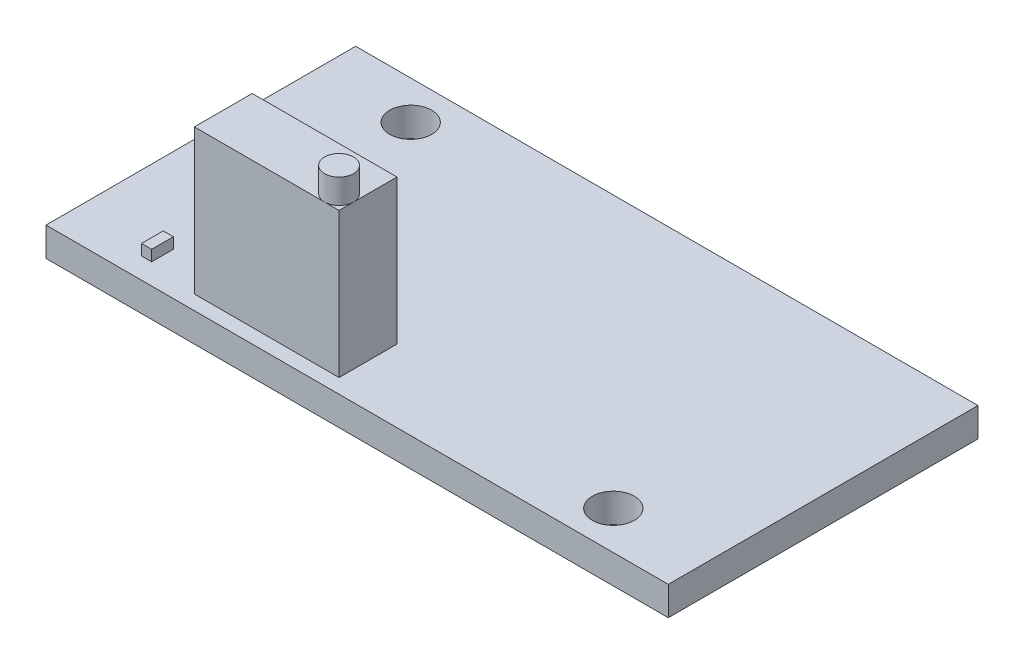
ISO-10303-21;
HEADER;
FILE_DESCRIPTION(('STEP AP214'),'2;1');
FILE_NAME('part.step','',(''),(''),'','','');
FILE_SCHEMA(('AUTOMOTIVE_DESIGN { 1 0 10303 214 1 1 1 1 }'));
ENDSEC;
DATA;
#1=APPLICATION_CONTEXT('core data for automotive mechanical design processes');
#2=APPLICATION_PROTOCOL_DEFINITION('international standard','automotive_design',2000,#1);
#3=PRODUCT_CONTEXT('',#1,'mechanical');
#4=PRODUCT('Part','Part','',(#3));
#5=PRODUCT_RELATED_PRODUCT_CATEGORY('part','',(#4));
#6=PRODUCT_DEFINITION_FORMATION('','',#4);
#7=PRODUCT_DEFINITION_CONTEXT('part definition',#1,'design');
#8=PRODUCT_DEFINITION('design','',#6,#7);
#9=PRODUCT_DEFINITION_SHAPE('','',#8);
#10=(LENGTH_UNIT() NAMED_UNIT(*) SI_UNIT(.MILLI.,.METRE.));
#11=(NAMED_UNIT(*) PLANE_ANGLE_UNIT() SI_UNIT($,.RADIAN.));
#12=(NAMED_UNIT(*) SI_UNIT($,.STERADIAN.) SOLID_ANGLE_UNIT());
#13=UNCERTAINTY_MEASURE_WITH_UNIT(LENGTH_MEASURE(1.E-05),#10,'distance_accuracy_value','');
#14=(GEOMETRIC_REPRESENTATION_CONTEXT(3) GLOBAL_UNCERTAINTY_ASSIGNED_CONTEXT((#13)) GLOBAL_UNIT_ASSIGNED_CONTEXT((#10,
#11,#12)) REPRESENTATION_CONTEXT('',''));
#15=CARTESIAN_POINT('',(0.,0.,0.));
#16=DIRECTION('',(0.,0.,1.));
#17=DIRECTION('',(1.,0.,0.));
#18=AXIS2_PLACEMENT_3D('',#15,#16,#17);
#19=CARTESIAN_POINT('',(0.,2.,0.));
#20=DIRECTION('',(0.,-1.,0.));
#21=DIRECTION('',(0.,0.,-1.));
#22=AXIS2_PLACEMENT_3D('',#19,#20,#21);
#23=PLANE('',#22);
#24=DIRECTION('',(0.,0.,1.));
#25=VECTOR('',#24,1.);
#26=CARTESIAN_POINT('',(-12.25,2.,9.7));
#27=LINE('',#26,#25);
#28=CARTESIAN_POINT('',(-12.25,2.,5.7));
#29=VERTEX_POINT('',#28);
#30=CARTESIAN_POINT('',(-12.25,2.,9.7));
#31=VERTEX_POINT('',#30);
#32=EDGE_CURVE('E160',#29,#31,#27,.T.);
#33=ORIENTED_EDGE('',*,*,#32,.F.);
#34=DIRECTION('',(-1.,0.,0.));
#35=VECTOR('',#34,1.);
#36=CARTESIAN_POINT('',(-2.25,2.,5.7));
#37=LINE('',#36,#35);
#38=CARTESIAN_POINT('',(-2.25,2.,5.7));
#39=VERTEX_POINT('',#38);
#40=EDGE_CURVE('E166',#39,#29,#37,.T.);
#41=ORIENTED_EDGE('',*,*,#40,.F.);
#42=DIRECTION('',(0.,0.,-1.));
#43=VECTOR('',#42,1.);
#44=CARTESIAN_POINT('',(-2.25,2.,9.7));
#45=LINE('',#44,#43);
#46=CARTESIAN_POINT('',(-2.25,2.,9.7));
#47=VERTEX_POINT('',#46);
#48=EDGE_CURVE('E181',#47,#39,#45,.T.);
#49=ORIENTED_EDGE('',*,*,#48,.F.);
#50=DIRECTION('',(1.,0.,0.));
#51=VECTOR('',#50,1.);
#52=CARTESIAN_POINT('',(-2.25,2.,9.7));
#53=LINE('',#52,#51);
#54=EDGE_CURVE('E178',#31,#47,#53,.T.);
#55=ORIENTED_EDGE('',*,*,#54,.F.);
#56=EDGE_LOOP('',(#33,#41,#49,#55));
#57=FACE_BOUND('',#56,.T.);
#58=CARTESIAN_POINT('',(-15.05,2.,-8.05));
#59=DIRECTION('',(0.,1.,0.));
#60=DIRECTION('',(0.,0.,1.));
#61=AXIS2_PLACEMENT_3D('',#58,#59,#60);
#62=CIRCLE('',#61,1.45);
#63=CARTESIAN_POINT('',(-15.05,2.,-6.6));
#64=VERTEX_POINT('',#63);
#65=EDGE_CURVE('E202',#64,#64,#62,.T.);
#66=ORIENTED_EDGE('',*,*,#65,.F.);
#67=EDGE_LOOP('',(#66));
#68=FACE_BOUND('',#67,.T.);
#69=CARTESIAN_POINT('',(15.05,2.,8.05));
#70=DIRECTION('',(0.,1.,0.));
#71=DIRECTION('',(0.,0.,1.));
#72=AXIS2_PLACEMENT_3D('',#69,#70,#71);
#73=CIRCLE('',#72,1.45);
#74=CARTESIAN_POINT('',(15.05,2.,9.5));
#75=VERTEX_POINT('',#74);
#76=EDGE_CURVE('E197',#75,#75,#73,.T.);
#77=ORIENTED_EDGE('',*,*,#76,.F.);
#78=EDGE_LOOP('',(#77));
#79=FACE_BOUND('',#78,.T.);
#80=DIRECTION('',(0.,0.,-1.));
#81=VECTOR('',#80,1.);
#82=CARTESIAN_POINT('',(21.5,2.,10.7));
#83=LINE('',#82,#81);
#84=CARTESIAN_POINT('',(21.5,2.,10.7));
#85=VERTEX_POINT('',#84);
#86=CARTESIAN_POINT('',(21.5,2.,-10.7));
#87=VERTEX_POINT('',#86);
#88=EDGE_CURVE('E210',#85,#87,#83,.T.);
#89=ORIENTED_EDGE('',*,*,#88,.T.);
#90=DIRECTION('',(-1.,0.,0.));
#91=VECTOR('',#90,1.);
#92=CARTESIAN_POINT('',(-21.5,2.,-10.7));
#93=LINE('',#92,#91);
#94=CARTESIAN_POINT('',(-21.5,2.,-10.7));
#95=VERTEX_POINT('',#94);
#96=EDGE_CURVE('E213',#87,#95,#93,.T.);
#97=ORIENTED_EDGE('',*,*,#96,.T.);
#98=DIRECTION('',(0.,0.,1.));
#99=VECTOR('',#98,1.);
#100=CARTESIAN_POINT('',(-21.5,2.,10.7));
#101=LINE('',#100,#99);
#102=CARTESIAN_POINT('',(-21.5,2.,10.7));
#103=VERTEX_POINT('',#102);
#104=EDGE_CURVE('E216',#95,#103,#101,.T.);
#105=ORIENTED_EDGE('',*,*,#104,.T.);
#106=DIRECTION('',(1.,0.,0.));
#107=VECTOR('',#106,1.);
#108=CARTESIAN_POINT('',(-21.5,2.,10.7));
#109=LINE('',#108,#107);
#110=EDGE_CURVE('E218',#103,#85,#109,.T.);
#111=ORIENTED_EDGE('',*,*,#110,.T.);
#112=EDGE_LOOP('',(#89,#97,#105,#111));
#113=FACE_BOUND('',#112,.T.);
#114=DIRECTION('',(0.,0.,1.));
#115=VECTOR('',#114,1.);
#116=CARTESIAN_POINT('',(-16.35,2.,7.75));
#117=LINE('',#116,#115);
#118=CARTESIAN_POINT('',(-16.35,2.,7.75));
#119=VERTEX_POINT('',#118);
#120=CARTESIAN_POINT('',(-16.35,2.,9.25));
#121=VERTEX_POINT('',#120);
#122=EDGE_CURVE('E151',#119,#121,#117,.T.);
#123=ORIENTED_EDGE('',*,*,#122,.F.);
#124=DIRECTION('',(-1.,0.,0.));
#125=VECTOR('',#124,1.);
#126=CARTESIAN_POINT('',(-15.65,2.,7.75));
#127=LINE('',#126,#125);
#128=CARTESIAN_POINT('',(-15.65,2.,7.75));
#129=VERTEX_POINT('',#128);
#130=EDGE_CURVE('E148',#129,#119,#127,.T.);
#131=ORIENTED_EDGE('',*,*,#130,.F.);
#132=DIRECTION('',(0.,0.,-1.));
#133=VECTOR('',#132,1.);
#134=CARTESIAN_POINT('',(-15.65,2.,7.75));
#135=LINE('',#134,#133);
#136=CARTESIAN_POINT('',(-15.65,2.,9.24999999999999));
#137=VERTEX_POINT('',#136);
#138=EDGE_CURVE('E56',#137,#129,#135,.T.);
#139=ORIENTED_EDGE('',*,*,#138,.F.);
#140=DIRECTION('',(1.,0.,0.));
#141=VECTOR('',#140,1.);
#142=CARTESIAN_POINT('',(-15.65,2.,9.24999999999999));
#143=LINE('',#142,#141);
#144=EDGE_CURVE('E51',#121,#137,#143,.T.);
#145=ORIENTED_EDGE('',*,*,#144,.F.);
#146=EDGE_LOOP('',(#123,#131,#139,#145));
#147=FACE_BOUND('',#146,.T.);
#148=ADVANCED_FACE('F34',(#57,#68,#79,#113,#147),#23,.F.);
#149=CARTESIAN_POINT('',(0.,12.,0.));
#150=DIRECTION('',(0.,1.,0.));
#151=DIRECTION('',(0.,0.,1.));
#152=AXIS2_PLACEMENT_3D('',#149,#150,#151);
#153=PLANE('',#152);
#154=CARTESIAN_POINT('',(-3.25,12.,8.7));
#155=DIRECTION('',(0.,1.,0.));
#156=DIRECTION('',(0.,0.,1.));
#157=AXIS2_PLACEMENT_3D('',#154,#155,#156);
#158=CIRCLE('',#157,1.);
#159=CARTESIAN_POINT('',(-3.25,12.,9.7));
#160=VERTEX_POINT('',#159);
#161=CARTESIAN_POINT('',(-2.25,12.,8.7));
#162=VERTEX_POINT('',#161);
#163=EDGE_CURVE('E44',#160,#162,#158,.T.);
#164=ORIENTED_EDGE('',*,*,#163,.F.);
#165=DIRECTION('',(1.,0.,0.));
#166=VECTOR('',#165,1.);
#167=CARTESIAN_POINT('',(-2.25,12.,9.7));
#168=LINE('',#167,#166);
#169=CARTESIAN_POINT('',(-2.25,12.,9.7));
#170=VERTEX_POINT('',#169);
#171=EDGE_CURVE('E165',#160,#170,#168,.T.);
#172=ORIENTED_EDGE('',*,*,#171,.T.);
#173=DIRECTION('',(0.,0.,-1.));
#174=VECTOR('',#173,1.);
#175=CARTESIAN_POINT('',(-2.25,12.,9.7));
#176=LINE('',#175,#174);
#177=EDGE_CURVE('E170',#170,#162,#176,.T.);
#178=ORIENTED_EDGE('',*,*,#177,.T.);
#179=EDGE_LOOP('',(#164,#172,#178));
#180=FACE_BOUND('',#179,.T.);
#181=ADVANCED_FACE('F256',(#180),#153,.T.);
#182=CARTESIAN_POINT('',(21.5,2.,10.7));
#183=DIRECTION('',(-1.,0.,0.));
#184=DIRECTION('',(0.,0.,1.));
#185=AXIS2_PLACEMENT_3D('',#182,#183,#184);
#186=PLANE('',#185);
#187=DIRECTION('',(0.,0.,-1.));
#188=VECTOR('',#187,1.);
#189=CARTESIAN_POINT('',(21.5,0.,10.7));
#190=LINE('',#189,#188);
#191=CARTESIAN_POINT('',(21.5,0.,10.7));
#192=VERTEX_POINT('',#191);
#193=CARTESIAN_POINT('',(21.5,0.,-10.7));
#194=VERTEX_POINT('',#193);
#195=EDGE_CURVE('E201',#192,#194,#190,.T.);
#196=ORIENTED_EDGE('',*,*,#195,.T.);
#197=DIRECTION('',(0.,-1.,0.));
#198=VECTOR('',#197,1.);
#199=CARTESIAN_POINT('',(21.5,2.,-10.7));
#200=LINE('',#199,#198);
#201=EDGE_CURVE('E38',#87,#194,#200,.T.);
#202=ORIENTED_EDGE('',*,*,#201,.F.);
#203=ORIENTED_EDGE('',*,*,#88,.F.);
#204=DIRECTION('',(0.,-1.,0.));
#205=VECTOR('',#204,1.);
#206=CARTESIAN_POINT('',(21.5,2.,10.7));
#207=LINE('',#206,#205);
#208=EDGE_CURVE('E220',#85,#192,#207,.T.);
#209=ORIENTED_EDGE('',*,*,#208,.T.);
#210=EDGE_LOOP('',(#196,#202,#203,#209));
#211=FACE_BOUND('',#210,.T.);
#212=ADVANCED_FACE('F36',(#211),#186,.F.);
#213=CARTESIAN_POINT('',(-21.5,2.,-10.7));
#214=DIRECTION('',(0.,0.,1.));
#215=DIRECTION('',(1.,0.,0.));
#216=AXIS2_PLACEMENT_3D('',#213,#214,#215);
#217=PLANE('',#216);
#218=DIRECTION('',(-1.,0.,0.));
#219=VECTOR('',#218,1.);
#220=CARTESIAN_POINT('',(-21.5,0.,-10.7));
#221=LINE('',#220,#219);
#222=CARTESIAN_POINT('',(-21.5,0.,-10.7));
#223=VERTEX_POINT('',#222);
#224=EDGE_CURVE('E223',#194,#223,#221,.T.);
#225=ORIENTED_EDGE('',*,*,#224,.T.);
#226=DIRECTION('',(0.,-1.,0.));
#227=VECTOR('',#226,1.);
#228=CARTESIAN_POINT('',(-21.5,2.,-10.7));
#229=LINE('',#228,#227);
#230=EDGE_CURVE('E232',#95,#223,#229,.T.);
#231=ORIENTED_EDGE('',*,*,#230,.F.);
#232=ORIENTED_EDGE('',*,*,#96,.F.);
#233=ORIENTED_EDGE('',*,*,#201,.T.);
#234=EDGE_LOOP('',(#225,#231,#232,#233));
#235=FACE_BOUND('',#234,.T.);
#236=ADVANCED_FACE('F241',(#235),#217,.F.);
#237=CARTESIAN_POINT('',(-21.5,2.,10.7));
#238=DIRECTION('',(1.,0.,0.));
#239=DIRECTION('',(0.,0.,-1.));
#240=AXIS2_PLACEMENT_3D('',#237,#238,#239);
#241=PLANE('',#240);
#242=DIRECTION('',(0.,0.,1.));
#243=VECTOR('',#242,1.);
#244=CARTESIAN_POINT('',(-21.5,0.,10.7));
#245=LINE('',#244,#243);
#246=CARTESIAN_POINT('',(-21.5,0.,10.7));
#247=VERTEX_POINT('',#246);
#248=EDGE_CURVE('E225',#223,#247,#245,.T.);
#249=ORIENTED_EDGE('',*,*,#248,.T.);
#250=DIRECTION('',(0.,-1.,0.));
#251=VECTOR('',#250,1.);
#252=CARTESIAN_POINT('',(-21.5,2.,10.7));
#253=LINE('',#252,#251);
#254=EDGE_CURVE('E230',#103,#247,#253,.T.);
#255=ORIENTED_EDGE('',*,*,#254,.F.);
#256=ORIENTED_EDGE('',*,*,#104,.F.);
#257=ORIENTED_EDGE('',*,*,#230,.T.);
#258=EDGE_LOOP('',(#249,#255,#256,#257));
#259=FACE_BOUND('',#258,.T.);
#260=ADVANCED_FACE('F250',(#259),#241,.F.);
#261=CARTESIAN_POINT('',(-21.5,2.,10.7));
#262=DIRECTION('',(0.,0.,-1.));
#263=DIRECTION('',(-1.,0.,0.));
#264=AXIS2_PLACEMENT_3D('',#261,#262,#263);
#265=PLANE('',#264);
#266=DIRECTION('',(1.,0.,0.));
#267=VECTOR('',#266,1.);
#268=CARTESIAN_POINT('',(-21.5,0.,10.7));
#269=LINE('',#268,#267);
#270=EDGE_CURVE('E214',#247,#192,#269,.T.);
#271=ORIENTED_EDGE('',*,*,#270,.T.);
#272=ORIENTED_EDGE('',*,*,#208,.F.);
#273=ORIENTED_EDGE('',*,*,#110,.F.);
#274=ORIENTED_EDGE('',*,*,#254,.T.);
#275=EDGE_LOOP('',(#271,#272,#273,#274));
#276=FACE_BOUND('',#275,.T.);
#277=ADVANCED_FACE('F253',(#276),#265,.F.);
#278=CARTESIAN_POINT('',(0.,0.,0.));
#279=DIRECTION('',(0.,-1.,0.));
#280=DIRECTION('',(0.,0.,-1.));
#281=AXIS2_PLACEMENT_3D('',#278,#279,#280);
#282=PLANE('',#281);
#283=CARTESIAN_POINT('',(-15.05,0.,-8.05));
#284=DIRECTION('',(0.,1.,0.));
#285=DIRECTION('',(0.,0.,1.));
#286=AXIS2_PLACEMENT_3D('',#283,#284,#285);
#287=CIRCLE('',#286,1.45);
#288=CARTESIAN_POINT('',(-15.05,0.,-6.6));
#289=VERTEX_POINT('',#288);
#290=EDGE_CURVE('E198',#289,#289,#287,.T.);
#291=ORIENTED_EDGE('',*,*,#290,.T.);
#292=EDGE_LOOP('',(#291));
#293=FACE_BOUND('',#292,.T.);
#294=CARTESIAN_POINT('',(15.05,0.,8.05));
#295=DIRECTION('',(0.,1.,0.));
#296=DIRECTION('',(0.,0.,1.));
#297=AXIS2_PLACEMENT_3D('',#294,#295,#296);
#298=CIRCLE('',#297,1.45);
#299=CARTESIAN_POINT('',(15.05,0.,9.5));
#300=VERTEX_POINT('',#299);
#301=EDGE_CURVE('E205',#300,#300,#298,.T.);
#302=ORIENTED_EDGE('',*,*,#301,.T.);
#303=EDGE_LOOP('',(#302));
#304=FACE_BOUND('',#303,.T.);
#305=ORIENTED_EDGE('',*,*,#195,.F.);
#306=ORIENTED_EDGE('',*,*,#270,.F.);
#307=ORIENTED_EDGE('',*,*,#248,.F.);
#308=ORIENTED_EDGE('',*,*,#224,.F.);
#309=EDGE_LOOP('',(#305,#306,#307,#308));
#310=FACE_BOUND('',#309,.T.);
#311=ADVANCED_FACE('F248',(#293,#304,#310),#282,.T.);
#312=CARTESIAN_POINT('',(15.05,0.,8.05));
#313=DIRECTION('',(0.,1.,0.));
#314=DIRECTION('',(0.,0.,1.));
#315=AXIS2_PLACEMENT_3D('',#312,#313,#314);
#316=CYLINDRICAL_SURFACE('',#315,1.45);
#317=ORIENTED_EDGE('',*,*,#301,.F.);
#318=EDGE_LOOP('',(#317));
#319=FACE_BOUND('',#318,.T.);
#320=ORIENTED_EDGE('',*,*,#76,.T.);
#321=EDGE_LOOP('',(#320));
#322=FACE_BOUND('',#321,.T.);
#323=ADVANCED_FACE('F317',(#319,#322),#316,.F.);
#324=CARTESIAN_POINT('',(-15.05,0.,-8.05));
#325=DIRECTION('',(0.,1.,0.));
#326=DIRECTION('',(0.,0.,1.));
#327=AXIS2_PLACEMENT_3D('',#324,#325,#326);
#328=CYLINDRICAL_SURFACE('',#327,1.45);
#329=ORIENTED_EDGE('',*,*,#290,.F.);
#330=EDGE_LOOP('',(#329));
#331=FACE_BOUND('',#330,.T.);
#332=ORIENTED_EDGE('',*,*,#65,.T.);
#333=EDGE_LOOP('',(#332));
#334=FACE_BOUND('',#333,.T.);
#335=ADVANCED_FACE('F313',(#331,#334),#328,.F.);
#336=CARTESIAN_POINT('',(-12.25,12.,9.7));
#337=DIRECTION('',(1.,0.,0.));
#338=DIRECTION('',(0.,0.,-1.));
#339=AXIS2_PLACEMENT_3D('',#336,#337,#338);
#340=PLANE('',#339);
#341=ORIENTED_EDGE('',*,*,#32,.T.);
#342=DIRECTION('',(0.,-1.,0.));
#343=VECTOR('',#342,1.);
#344=CARTESIAN_POINT('',(-12.25,12.,9.7));
#345=LINE('',#344,#343);
#346=CARTESIAN_POINT('',(-12.25,12.,9.7));
#347=VERTEX_POINT('',#346);
#348=EDGE_CURVE('E194',#347,#31,#345,.T.);
#349=ORIENTED_EDGE('',*,*,#348,.F.);
#350=DIRECTION('',(0.,0.,1.));
#351=VECTOR('',#350,1.);
#352=CARTESIAN_POINT('',(-12.25,12.,9.7));
#353=LINE('',#352,#351);
#354=CARTESIAN_POINT('',(-12.25,12.,5.7));
#355=VERTEX_POINT('',#354);
#356=EDGE_CURVE('E162',#355,#347,#353,.T.);
#357=ORIENTED_EDGE('',*,*,#356,.F.);
#358=DIRECTION('',(0.,-1.,0.));
#359=VECTOR('',#358,1.);
#360=CARTESIAN_POINT('',(-12.25,12.,5.7));
#361=LINE('',#360,#359);
#362=EDGE_CURVE('E175',#355,#29,#361,.T.);
#363=ORIENTED_EDGE('',*,*,#362,.T.);
#364=EDGE_LOOP('',(#341,#349,#357,#363));
#365=FACE_BOUND('',#364,.T.);
#366=ADVANCED_FACE('F309',(#365),#340,.F.);
#367=CARTESIAN_POINT('',(-2.25,12.,9.7));
#368=DIRECTION('',(0.,0.,-1.));
#369=DIRECTION('',(-1.,0.,0.));
#370=AXIS2_PLACEMENT_3D('',#367,#368,#369);
#371=PLANE('',#370);
#372=ORIENTED_EDGE('',*,*,#54,.T.);
#373=DIRECTION('',(0.,-1.,0.));
#374=VECTOR('',#373,1.);
#375=CARTESIAN_POINT('',(-2.25,12.,9.7));
#376=LINE('',#375,#374);
#377=EDGE_CURVE('E191',#170,#47,#376,.T.);
#378=ORIENTED_EDGE('',*,*,#377,.F.);
#379=ORIENTED_EDGE('',*,*,#171,.F.);
#380=EDGE_CURVE('E167',#347,#160,#168,.T.);
#381=ORIENTED_EDGE('',*,*,#380,.F.);
#382=ORIENTED_EDGE('',*,*,#348,.T.);
#383=EDGE_LOOP('',(#372,#378,#379,#381,#382));
#384=FACE_BOUND('',#383,.T.);
#385=ADVANCED_FACE('F305',(#384),#371,.F.);
#386=CARTESIAN_POINT('',(-2.25,12.,9.7));
#387=DIRECTION('',(-1.,0.,0.));
#388=DIRECTION('',(0.,0.,1.));
#389=AXIS2_PLACEMENT_3D('',#386,#387,#388);
#390=PLANE('',#389);
#391=ORIENTED_EDGE('',*,*,#48,.T.);
#392=DIRECTION('',(0.,-1.,0.));
#393=VECTOR('',#392,1.);
#394=CARTESIAN_POINT('',(-2.25,12.,5.7));
#395=LINE('',#394,#393);
#396=CARTESIAN_POINT('',(-2.25,12.,5.7));
#397=VERTEX_POINT('',#396);
#398=EDGE_CURVE('E188',#397,#39,#395,.T.);
#399=ORIENTED_EDGE('',*,*,#398,.F.);
#400=EDGE_CURVE('E169',#162,#397,#176,.T.);
#401=ORIENTED_EDGE('',*,*,#400,.F.);
#402=ORIENTED_EDGE('',*,*,#177,.F.);
#403=ORIENTED_EDGE('',*,*,#377,.T.);
#404=EDGE_LOOP('',(#391,#399,#401,#402,#403));
#405=FACE_BOUND('',#404,.T.);
#406=ADVANCED_FACE('F301',(#405),#390,.F.);
#407=CARTESIAN_POINT('',(-2.25,12.,5.7));
#408=DIRECTION('',(0.,0.,1.));
#409=DIRECTION('',(1.,0.,0.));
#410=AXIS2_PLACEMENT_3D('',#407,#408,#409);
#411=PLANE('',#410);
#412=ORIENTED_EDGE('',*,*,#40,.T.);
#413=ORIENTED_EDGE('',*,*,#362,.F.);
#414=DIRECTION('',(-1.,0.,0.));
#415=VECTOR('',#414,1.);
#416=CARTESIAN_POINT('',(-2.25,12.,5.7));
#417=LINE('',#416,#415);
#418=EDGE_CURVE('E173',#397,#355,#417,.T.);
#419=ORIENTED_EDGE('',*,*,#418,.F.);
#420=ORIENTED_EDGE('',*,*,#398,.T.);
#421=EDGE_LOOP('',(#412,#413,#419,#420));
#422=FACE_BOUND('',#421,.T.);
#423=ADVANCED_FACE('F297',(#422),#411,.F.);
#424=EDGE_CURVE('E11',#162,#160,#158,.T.);
#425=ORIENTED_EDGE('',*,*,#424,.F.);
#426=ORIENTED_EDGE('',*,*,#400,.T.);
#427=ORIENTED_EDGE('',*,*,#418,.T.);
#428=ORIENTED_EDGE('',*,*,#356,.T.);
#429=ORIENTED_EDGE('',*,*,#380,.T.);
#430=EDGE_LOOP('',(#425,#426,#427,#428,#429));
#431=FACE_BOUND('',#430,.T.);
#432=ADVANCED_FACE('F293',(#431),#153,.T.);
#433=CARTESIAN_POINT('',(-3.25,13.7,8.7));
#434=DIRECTION('',(0.,-1.,0.));
#435=DIRECTION('',(0.,0.,-1.));
#436=AXIS2_PLACEMENT_3D('',#433,#434,#435);
#437=CYLINDRICAL_SURFACE('',#436,1.);
#438=CARTESIAN_POINT('',(-3.25,13.7,8.7));
#439=DIRECTION('',(0.,1.,0.));
#440=DIRECTION('',(0.,0.,1.));
#441=AXIS2_PLACEMENT_3D('',#438,#439,#440);
#442=CIRCLE('',#441,1.);
#443=CARTESIAN_POINT('',(-3.25,13.7,9.7));
#444=VERTEX_POINT('',#443);
#445=EDGE_CURVE('E154',#444,#444,#442,.T.);
#446=ORIENTED_EDGE('',*,*,#445,.F.);
#447=EDGE_LOOP('',(#446));
#448=FACE_BOUND('',#447,.T.);
#449=ORIENTED_EDGE('',*,*,#163,.T.);
#450=ORIENTED_EDGE('',*,*,#424,.T.);
#451=EDGE_LOOP('',(#449,#450));
#452=FACE_BOUND('',#451,.T.);
#453=ADVANCED_FACE('F289',(#448,#452),#437,.T.);
#454=CARTESIAN_POINT('',(-3.25,13.7,8.7));
#455=DIRECTION('',(0.,1.,0.));
#456=DIRECTION('',(0.,0.,1.));
#457=AXIS2_PLACEMENT_3D('',#454,#455,#456);
#458=PLANE('',#457);
#459=ORIENTED_EDGE('',*,*,#445,.T.);
#460=EDGE_LOOP('',(#459));
#461=FACE_BOUND('',#460,.T.);
#462=ADVANCED_FACE('F286',(#461),#458,.T.);
#463=CARTESIAN_POINT('',(-16.35,2.75,7.75));
#464=DIRECTION('',(1.,0.,0.));
#465=DIRECTION('',(0.,0.,-1.));
#466=AXIS2_PLACEMENT_3D('',#463,#464,#465);
#467=PLANE('',#466);
#468=ORIENTED_EDGE('',*,*,#122,.T.);
#469=DIRECTION('',(0.,-1.,0.));
#470=VECTOR('',#469,1.);
#471=CARTESIAN_POINT('',(-16.35,2.75,9.25));
#472=LINE('',#471,#470);
#473=CARTESIAN_POINT('',(-16.35,2.75,9.25));
#474=VERTEX_POINT('',#473);
#475=EDGE_CURVE('E132',#474,#121,#472,.T.);
#476=ORIENTED_EDGE('',*,*,#475,.F.);
#477=DIRECTION('',(0.,0.,1.));
#478=VECTOR('',#477,1.);
#479=CARTESIAN_POINT('',(-16.35,2.75,7.75));
#480=LINE('',#479,#478);
#481=CARTESIAN_POINT('',(-16.35,2.75,7.75));
#482=VERTEX_POINT('',#481);
#483=EDGE_CURVE('E139',#482,#474,#480,.T.);
#484=ORIENTED_EDGE('',*,*,#483,.F.);
#485=DIRECTION('',(0.,-1.,0.));
#486=VECTOR('',#485,1.);
#487=CARTESIAN_POINT('',(-16.35,2.75,7.75));
#488=LINE('',#487,#486);
#489=EDGE_CURVE('E264',#482,#119,#488,.T.);
#490=ORIENTED_EDGE('',*,*,#489,.T.);
#491=EDGE_LOOP('',(#468,#476,#484,#490));
#492=FACE_BOUND('',#491,.T.);
#493=ADVANCED_FACE('F150',(#492),#467,.F.);
#494=CARTESIAN_POINT('',(-15.65,2.75,9.24999999999999));
#495=DIRECTION('',(0.,0.,-1.));
#496=DIRECTION('',(-1.,0.,0.));
#497=AXIS2_PLACEMENT_3D('',#494,#495,#496);
#498=PLANE('',#497);
#499=ORIENTED_EDGE('',*,*,#144,.T.);
#500=DIRECTION('',(0.,-1.,0.));
#501=VECTOR('',#500,1.);
#502=CARTESIAN_POINT('',(-15.65,2.75,9.24999999999999));
#503=LINE('',#502,#501);
#504=CARTESIAN_POINT('',(-15.65,2.75,9.24999999999999));
#505=VERTEX_POINT('',#504);
#506=EDGE_CURVE('E135',#505,#137,#503,.T.);
#507=ORIENTED_EDGE('',*,*,#506,.F.);
#508=DIRECTION('',(1.,0.,0.));
#509=VECTOR('',#508,1.);
#510=CARTESIAN_POINT('',(-15.65,2.75,9.24999999999999));
#511=LINE('',#510,#509);
#512=EDGE_CURVE('E128',#474,#505,#511,.T.);
#513=ORIENTED_EDGE('',*,*,#512,.F.);
#514=ORIENTED_EDGE('',*,*,#475,.T.);
#515=EDGE_LOOP('',(#499,#507,#513,#514));
#516=FACE_BOUND('',#515,.T.);
#517=ADVANCED_FACE('F130',(#516),#498,.F.);
#518=CARTESIAN_POINT('',(-15.65,2.75,7.75));
#519=DIRECTION('',(-1.,0.,0.));
#520=DIRECTION('',(0.,0.,1.));
#521=AXIS2_PLACEMENT_3D('',#518,#519,#520);
#522=PLANE('',#521);
#523=ORIENTED_EDGE('',*,*,#138,.T.);
#524=DIRECTION('',(0.,-1.,0.));
#525=VECTOR('',#524,1.);
#526=CARTESIAN_POINT('',(-15.65,2.75,7.75));
#527=LINE('',#526,#525);
#528=CARTESIAN_POINT('',(-15.65,2.75,7.75));
#529=VERTEX_POINT('',#528);
#530=EDGE_CURVE('E155',#529,#129,#527,.T.);
#531=ORIENTED_EDGE('',*,*,#530,.F.);
#532=DIRECTION('',(0.,0.,-1.));
#533=VECTOR('',#532,1.);
#534=CARTESIAN_POINT('',(-15.65,2.75,7.75));
#535=LINE('',#534,#533);
#536=EDGE_CURVE('E138',#505,#529,#535,.T.);
#537=ORIENTED_EDGE('',*,*,#536,.F.);
#538=ORIENTED_EDGE('',*,*,#506,.T.);
#539=EDGE_LOOP('',(#523,#531,#537,#538));
#540=FACE_BOUND('',#539,.T.);
#541=ADVANCED_FACE('F273',(#540),#522,.F.);
#542=CARTESIAN_POINT('',(-15.65,2.75,7.75));
#543=DIRECTION('',(0.,0.,1.));
#544=DIRECTION('',(1.,0.,0.));
#545=AXIS2_PLACEMENT_3D('',#542,#543,#544);
#546=PLANE('',#545);
#547=ORIENTED_EDGE('',*,*,#130,.T.);
#548=ORIENTED_EDGE('',*,*,#489,.F.);
#549=DIRECTION('',(-1.,0.,0.));
#550=VECTOR('',#549,1.);
#551=CARTESIAN_POINT('',(-15.65,2.75,7.75));
#552=LINE('',#551,#550);
#553=EDGE_CURVE('E144',#529,#482,#552,.T.);
#554=ORIENTED_EDGE('',*,*,#553,.F.);
#555=ORIENTED_EDGE('',*,*,#530,.T.);
#556=EDGE_LOOP('',(#547,#548,#554,#555));
#557=FACE_BOUND('',#556,.T.);
#558=ADVANCED_FACE('F263',(#557),#546,.F.);
#559=CARTESIAN_POINT('',(0.,2.75,0.));
#560=DIRECTION('',(0.,-1.,0.));
#561=DIRECTION('',(0.,0.,-1.));
#562=AXIS2_PLACEMENT_3D('',#559,#560,#561);
#563=PLANE('',#562);
#564=ORIENTED_EDGE('',*,*,#483,.T.);
#565=ORIENTED_EDGE('',*,*,#512,.T.);
#566=ORIENTED_EDGE('',*,*,#536,.T.);
#567=ORIENTED_EDGE('',*,*,#553,.T.);
#568=EDGE_LOOP('',(#564,#565,#566,#567));
#569=FACE_BOUND('',#568,.T.);
#570=ADVANCED_FACE('F142',(#569),#563,.F.);
#571=CLOSED_SHELL('',(#148,#181,#212,#236,#260,#277,#311,#323,#335,#366,#385,#406,#423,#432,
#453,#462,#493,#517,#541,#558,#570));
#572=MANIFOLD_SOLID_BREP('B2',#571);
#573=ADVANCED_BREP_SHAPE_REPRESENTATION('',(#18,#572),#14);
#574=SHAPE_DEFINITION_REPRESENTATION(#9,#573);
ENDSEC;
END-ISO-10303-21;
